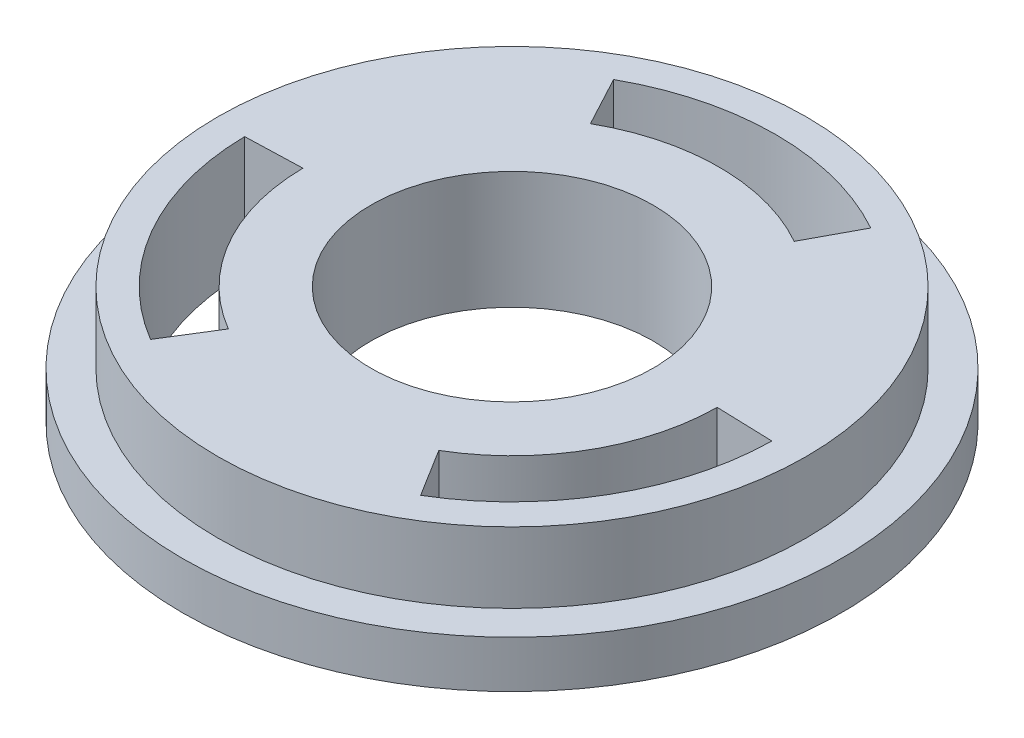
ISO-10303-21;
HEADER;
FILE_DESCRIPTION(('STEP AP214'),'2;1');
FILE_NAME('part.step','',(''),(''),'','','');
FILE_SCHEMA(('AUTOMOTIVE_DESIGN { 1 0 10303 214 1 1 1 1 }'));
ENDSEC;
DATA;
#1=APPLICATION_CONTEXT('core data for automotive mechanical design processes');
#2=APPLICATION_PROTOCOL_DEFINITION('international standard','automotive_design',2000,#1);
#3=PRODUCT_CONTEXT('',#1,'mechanical');
#4=PRODUCT('Part','Part','',(#3));
#5=PRODUCT_RELATED_PRODUCT_CATEGORY('part','',(#4));
#6=PRODUCT_DEFINITION_FORMATION('','',#4);
#7=PRODUCT_DEFINITION_CONTEXT('part definition',#1,'design');
#8=PRODUCT_DEFINITION('design','',#6,#7);
#9=PRODUCT_DEFINITION_SHAPE('','',#8);
#10=(LENGTH_UNIT() NAMED_UNIT(*) SI_UNIT(.MILLI.,.METRE.));
#11=(NAMED_UNIT(*) PLANE_ANGLE_UNIT() SI_UNIT($,.RADIAN.));
#12=(NAMED_UNIT(*) SI_UNIT($,.STERADIAN.) SOLID_ANGLE_UNIT());
#13=UNCERTAINTY_MEASURE_WITH_UNIT(LENGTH_MEASURE(1.E-05),#10,'distance_accuracy_value','');
#14=(GEOMETRIC_REPRESENTATION_CONTEXT(3) GLOBAL_UNCERTAINTY_ASSIGNED_CONTEXT((#13)) GLOBAL_UNIT_ASSIGNED_CONTEXT((#10,
#11,#12)) REPRESENTATION_CONTEXT('',''));
#15=CARTESIAN_POINT('',(0.,0.,0.));
#16=DIRECTION('',(0.,0.,1.));
#17=DIRECTION('',(1.,0.,0.));
#18=AXIS2_PLACEMENT_3D('',#15,#16,#17);
#19=CARTESIAN_POINT('',(0.,2.6,0.));
#20=DIRECTION('',(0.,-1.,0.));
#21=DIRECTION('',(0.,0.,-1.));
#22=AXIS2_PLACEMENT_3D('',#19,#20,#21);
#23=PLANE('',#22);
#24=DIRECTION('',(-0.99948778805349,0.,-0.0320025238370732));
#25=VECTOR('',#24,1.);
#26=CARTESIAN_POINT('',(11.1988787890392,2.6,0.158473557444053));
#27=LINE('',#26,#25);
#28=CARTESIAN_POINT('',(11.1988787890392,2.6,0.158473557444053));
#29=VERTEX_POINT('',#28);
#30=CARTESIAN_POINT('',(8.79962118307565,2.6,0.0816519097522282));
#31=VERTEX_POINT('',#30);
#32=EDGE_CURVE('E144',#29,#31,#27,.T.);
#33=ORIENTED_EDGE('',*,*,#32,.F.);
#34=CARTESIAN_POINT('',(0.,2.6,0.));
#35=DIRECTION('',(0.,1.,0.));
#36=DIRECTION('',(0.,0.,1.));
#37=AXIS2_PLACEMENT_3D('',#34,#35,#36);
#38=CIRCLE('',#37,11.2);
#39=CARTESIAN_POINT('',(5.73668152109433,2.6,9.61927674648852));
#40=VERTEX_POINT('',#39);
#41=EDGE_CURVE('E179',#40,#29,#38,.T.);
#42=ORIENTED_EDGE('',*,*,#41,.F.);
#43=DIRECTION('',(0.527458892654878,0.,0.849580553308096));
#44=VECTOR('',#43,1.);
#45=CARTESIAN_POINT('',(4.47052321965086,2.6,7.57986953334702));
#46=LINE('',#45,#44);
#47=CARTESIAN_POINT('',(4.47052321965086,2.6,7.57986953334702));
#48=VERTEX_POINT('',#47);
#49=EDGE_CURVE('E181',#48,#40,#46,.T.);
#50=ORIENTED_EDGE('',*,*,#49,.F.);
#51=CARTESIAN_POINT('',(0.,2.6,0.));
#52=DIRECTION('',(0.,-1.,0.));
#53=DIRECTION('',(0.,0.,1.));
#54=AXIS2_PLACEMENT_3D('',#51,#52,#53);
#55=CIRCLE('',#54,8.8);
#56=EDGE_CURVE('E185',#31,#48,#55,.T.);
#57=ORIENTED_EDGE('',*,*,#56,.F.);
#58=EDGE_LOOP('',(#33,#42,#50,#57));
#59=FACE_BOUND('',#58,.T.);
#60=DIRECTION('',(0.472028895398614,0.,0.88158307714518));
#61=VECTOR('',#60,1.);
#62=CARTESIAN_POINT('',(-5.46219726794484,2.6,-9.77775030393269));
#63=LINE('',#62,#61);
#64=CARTESIAN_POINT('',(-5.46219726794484,2.6,-9.77775030393269));
#65=VERTEX_POINT('',#64);
#66=CARTESIAN_POINT('',(-4.32909796342481,2.6,-7.66152144309935));
#67=VERTEX_POINT('',#66);
#68=EDGE_CURVE('E155',#65,#67,#63,.T.);
#69=ORIENTED_EDGE('',*,*,#68,.F.);
#70=CARTESIAN_POINT('',(0.,2.6,0.));
#71=DIRECTION('',(0.,1.,0.));
#72=DIRECTION('',(0.,0.,1.));
#73=AXIS2_PLACEMENT_3D('',#70,#71,#72);
#74=CIRCLE('',#73,11.2);
#75=CARTESIAN_POINT('',(5.46219726794491,2.6,-9.77775030393265));
#76=VERTEX_POINT('',#75);
#77=EDGE_CURVE('E136',#76,#65,#74,.T.);
#78=ORIENTED_EDGE('',*,*,#77,.F.);
#79=DIRECTION('',(0.47202889539862,0.,-0.881583077145177));
#80=VECTOR('',#79,1.);
#81=CARTESIAN_POINT('',(4.32909796342486,2.6,-7.66152144309931));
#82=LINE('',#81,#80);
#83=CARTESIAN_POINT('',(4.32909796342486,2.6,-7.66152144309932));
#84=VERTEX_POINT('',#83);
#85=EDGE_CURVE('E147',#84,#76,#82,.T.);
#86=ORIENTED_EDGE('',*,*,#85,.F.);
#87=CARTESIAN_POINT('',(0.,2.6,0.));
#88=DIRECTION('',(0.,-1.,0.));
#89=DIRECTION('',(0.,0.,1.));
#90=AXIS2_PLACEMENT_3D('',#87,#88,#89);
#91=CIRCLE('',#90,8.8);
#92=EDGE_CURVE('E152',#67,#84,#91,.T.);
#93=ORIENTED_EDGE('',*,*,#92,.F.);
#94=EDGE_LOOP('',(#69,#78,#86,#93));
#95=FACE_BOUND('',#94,.T.);
#96=DIRECTION('',(-0.999487788053489,0.,0.03200252383708));
#97=VECTOR('',#96,1.);
#98=CARTESIAN_POINT('',(-8.79962118307565,2.6,0.0816519097522901));
#99=LINE('',#98,#97);
#100=CARTESIAN_POINT('',(-8.79962118307565,2.6,0.0816519097522901));
#101=VERTEX_POINT('',#100);
#102=CARTESIAN_POINT('',(-11.1988787890391,2.6,0.158473557444124));
#103=VERTEX_POINT('',#102);
#104=EDGE_CURVE('E163',#101,#103,#99,.T.);
#105=ORIENTED_EDGE('',*,*,#104,.F.);
#106=CARTESIAN_POINT('',(0.,2.6,0.));
#107=DIRECTION('',(0.,-1.,0.));
#108=DIRECTION('',(0.,0.,1.));
#109=AXIS2_PLACEMENT_3D('',#106,#107,#108);
#110=CIRCLE('',#109,8.8);
#111=CARTESIAN_POINT('',(-4.47052321965081,2.6,7.57986953334706));
#112=VERTEX_POINT('',#111);
#113=EDGE_CURVE('E203',#112,#101,#110,.T.);
#114=ORIENTED_EDGE('',*,*,#113,.F.);
#115=DIRECTION('',(0.527458892654872,0.,-0.849580553308099));
#116=VECTOR('',#115,1.);
#117=CARTESIAN_POINT('',(-5.73668152109427,2.6,9.61927674648856));
#118=LINE('',#117,#116);
#119=CARTESIAN_POINT('',(-5.73668152109427,2.6,9.61927674648856));
#120=VERTEX_POINT('',#119);
#121=EDGE_CURVE('E218',#120,#112,#118,.T.);
#122=ORIENTED_EDGE('',*,*,#121,.F.);
#123=CARTESIAN_POINT('',(0.,2.6,0.));
#124=DIRECTION('',(0.,1.,0.));
#125=DIRECTION('',(0.,0.,1.));
#126=AXIS2_PLACEMENT_3D('',#123,#124,#125);
#127=CIRCLE('',#126,11.2);
#128=EDGE_CURVE('E215',#103,#120,#127,.T.);
#129=ORIENTED_EDGE('',*,*,#128,.F.);
#130=EDGE_LOOP('',(#105,#114,#122,#129));
#131=FACE_BOUND('',#130,.T.);
#132=CARTESIAN_POINT('',(0.,2.6,0.));
#133=DIRECTION('',(0.,-1.,0.));
#134=DIRECTION('',(0.,0.,-1.));
#135=AXIS2_PLACEMENT_3D('',#132,#133,#134);
#136=CIRCLE('',#135,12.5);
#137=CARTESIAN_POINT('',(0.,2.6,-12.5));
#138=VERTEX_POINT('',#137);
#139=EDGE_CURVE('E11',#138,#138,#136,.F.);
#140=ORIENTED_EDGE('',*,*,#139,.T.);
#141=EDGE_LOOP('',(#140));
#142=FACE_BOUND('',#141,.T.);
#143=CARTESIAN_POINT('',(0.,2.6,0.));
#144=DIRECTION('',(0.,-1.,0.));
#145=DIRECTION('',(0.,0.,-1.));
#146=AXIS2_PLACEMENT_3D('',#143,#144,#145);
#147=CIRCLE('',#146,6.);
#148=CARTESIAN_POINT('',(0.,2.6,-6.));
#149=VERTEX_POINT('',#148);
#150=EDGE_CURVE('E50',#149,#149,#147,.F.);
#151=ORIENTED_EDGE('',*,*,#150,.F.);
#152=EDGE_LOOP('',(#151));
#153=FACE_BOUND('',#152,.T.);
#154=ADVANCED_FACE('F43',(#59,#95,#131,#142,#153),#23,.F.);
#155=CARTESIAN_POINT('',(0.,0.,0.));
#156=DIRECTION('',(0.,-1.,0.));
#157=DIRECTION('',(0.,0.,-1.));
#158=AXIS2_PLACEMENT_3D('',#155,#156,#157);
#159=CYLINDRICAL_SURFACE('',#158,14.);
#160=CARTESIAN_POINT('',(0.,-2.4,0.));
#161=DIRECTION('',(0.,-1.,0.));
#162=DIRECTION('',(0.,0.,-1.));
#163=AXIS2_PLACEMENT_3D('',#160,#161,#162);
#164=CIRCLE('',#163,14.);
#165=CARTESIAN_POINT('',(0.,-2.4,-14.));
#166=VERTEX_POINT('',#165);
#167=EDGE_CURVE('E236',#166,#166,#164,.T.);
#168=ORIENTED_EDGE('',*,*,#167,.F.);
#169=EDGE_LOOP('',(#168));
#170=FACE_BOUND('',#169,.T.);
#171=CARTESIAN_POINT('',(0.,-0.400000000000002,0.));
#172=DIRECTION('',(0.,-1.,0.));
#173=DIRECTION('',(0.,0.,-1.));
#174=AXIS2_PLACEMENT_3D('',#171,#172,#173);
#175=CIRCLE('',#174,14.);
#176=CARTESIAN_POINT('',(0.,-0.400000000000002,-14.));
#177=VERTEX_POINT('',#176);
#178=EDGE_CURVE('E233',#177,#177,#175,.T.);
#179=ORIENTED_EDGE('',*,*,#178,.T.);
#180=EDGE_LOOP('',(#179));
#181=FACE_BOUND('',#180,.T.);
#182=ADVANCED_FACE('F248',(#170,#181),#159,.T.);
#183=CARTESIAN_POINT('',(-6.,-2.4,0.));
#184=DIRECTION('',(0.,1.,0.));
#185=DIRECTION('',(0.,0.,1.));
#186=AXIS2_PLACEMENT_3D('',#183,#184,#185);
#187=PLANE('',#186);
#188=DIRECTION('',(0.527458892654878,0.,0.849580553308096));
#189=VECTOR('',#188,1.);
#190=CARTESIAN_POINT('',(4.47052321965086,-2.4,7.57986953334702));
#191=LINE('',#190,#189);
#192=CARTESIAN_POINT('',(4.47052321965086,-2.4,7.57986953334702));
#193=VERTEX_POINT('',#192);
#194=CARTESIAN_POINT('',(5.73668152109433,-2.4,9.61927674648852));
#195=VERTEX_POINT('',#194);
#196=EDGE_CURVE('E172',#193,#195,#191,.T.);
#197=ORIENTED_EDGE('',*,*,#196,.T.);
#198=CARTESIAN_POINT('',(0.,-2.4,0.));
#199=DIRECTION('',(0.,1.,0.));
#200=DIRECTION('',(0.,0.,1.));
#201=AXIS2_PLACEMENT_3D('',#198,#199,#200);
#202=CIRCLE('',#201,11.2);
#203=CARTESIAN_POINT('',(11.1988787890392,-2.4,0.158473557444053));
#204=VERTEX_POINT('',#203);
#205=EDGE_CURVE('E182',#195,#204,#202,.T.);
#206=ORIENTED_EDGE('',*,*,#205,.T.);
#207=DIRECTION('',(-0.99948778805349,0.,-0.0320025238370732));
#208=VECTOR('',#207,1.);
#209=CARTESIAN_POINT('',(11.1988787890392,-2.4,0.158473557444053));
#210=LINE('',#209,#208);
#211=CARTESIAN_POINT('',(8.79962118307565,-2.4,0.0816519097522283));
#212=VERTEX_POINT('',#211);
#213=EDGE_CURVE('E194',#204,#212,#210,.T.);
#214=ORIENTED_EDGE('',*,*,#213,.T.);
#215=CARTESIAN_POINT('',(0.,-2.4,0.));
#216=DIRECTION('',(0.,-1.,0.));
#217=DIRECTION('',(0.,0.,1.));
#218=AXIS2_PLACEMENT_3D('',#215,#216,#217);
#219=CIRCLE('',#218,8.8);
#220=EDGE_CURVE('E191',#212,#193,#219,.T.);
#221=ORIENTED_EDGE('',*,*,#220,.T.);
#222=EDGE_LOOP('',(#197,#206,#214,#221));
#223=FACE_BOUND('',#222,.T.);
#224=DIRECTION('',(0.47202889539862,0.,-0.881583077145177));
#225=VECTOR('',#224,1.);
#226=CARTESIAN_POINT('',(4.32909796342486,-2.4,-7.66152144309931));
#227=LINE('',#226,#225);
#228=CARTESIAN_POINT('',(4.32909796342486,-2.4,-7.66152144309932));
#229=VERTEX_POINT('',#228);
#230=CARTESIAN_POINT('',(5.46219726794491,-2.4,-9.77775030393265));
#231=VERTEX_POINT('',#230);
#232=EDGE_CURVE('E164',#229,#231,#227,.T.);
#233=ORIENTED_EDGE('',*,*,#232,.T.);
#234=CARTESIAN_POINT('',(0.,-2.4,0.));
#235=DIRECTION('',(0.,1.,0.));
#236=DIRECTION('',(0.,0.,1.));
#237=AXIS2_PLACEMENT_3D('',#234,#235,#236);
#238=CIRCLE('',#237,11.2);
#239=CARTESIAN_POINT('',(-5.46219726794484,-2.4,-9.77775030393269));
#240=VERTEX_POINT('',#239);
#241=EDGE_CURVE('E139',#231,#240,#238,.T.);
#242=ORIENTED_EDGE('',*,*,#241,.T.);
#243=DIRECTION('',(0.472028895398614,0.,0.88158307714518));
#244=VECTOR('',#243,1.);
#245=CARTESIAN_POINT('',(-5.46219726794484,-2.4,-9.77775030393269));
#246=LINE('',#245,#244);
#247=CARTESIAN_POINT('',(-4.32909796342481,-2.4,-7.66152144309935));
#248=VERTEX_POINT('',#247);
#249=EDGE_CURVE('E157',#240,#248,#246,.T.);
#250=ORIENTED_EDGE('',*,*,#249,.T.);
#251=CARTESIAN_POINT('',(0.,-2.4,0.));
#252=DIRECTION('',(0.,-1.,0.));
#253=DIRECTION('',(0.,0.,1.));
#254=AXIS2_PLACEMENT_3D('',#251,#252,#253);
#255=CIRCLE('',#254,8.8);
#256=EDGE_CURVE('E166',#248,#229,#255,.T.);
#257=ORIENTED_EDGE('',*,*,#256,.T.);
#258=EDGE_LOOP('',(#233,#242,#250,#257));
#259=FACE_BOUND('',#258,.T.);
#260=DIRECTION('',(0.527458892654872,0.,-0.849580553308099));
#261=VECTOR('',#260,1.);
#262=CARTESIAN_POINT('',(-5.73668152109427,-2.4,9.61927674648856));
#263=LINE('',#262,#261);
#264=CARTESIAN_POINT('',(-5.73668152109427,-2.4,9.61927674648856));
#265=VERTEX_POINT('',#264);
#266=CARTESIAN_POINT('',(-4.47052321965081,-2.4,7.57986953334706));
#267=VERTEX_POINT('',#266);
#268=EDGE_CURVE('E209',#265,#267,#263,.T.);
#269=ORIENTED_EDGE('',*,*,#268,.T.);
#270=CARTESIAN_POINT('',(0.,-2.4,0.));
#271=DIRECTION('',(0.,-1.,0.));
#272=DIRECTION('',(0.,0.,1.));
#273=AXIS2_PLACEMENT_3D('',#270,#271,#272);
#274=CIRCLE('',#273,8.8);
#275=CARTESIAN_POINT('',(-8.79962118307565,-2.4,0.0816519097522901));
#276=VERTEX_POINT('',#275);
#277=EDGE_CURVE('E199',#267,#276,#274,.T.);
#278=ORIENTED_EDGE('',*,*,#277,.T.);
#279=DIRECTION('',(-0.999487788053489,0.,0.03200252383708));
#280=VECTOR('',#279,1.);
#281=CARTESIAN_POINT('',(-8.79962118307565,-2.4,0.0816519097522901));
#282=LINE('',#281,#280);
#283=CARTESIAN_POINT('',(-11.1988787890391,-2.4,0.158473557444131));
#284=VERTEX_POINT('',#283);
#285=EDGE_CURVE('E202',#276,#284,#282,.T.);
#286=ORIENTED_EDGE('',*,*,#285,.T.);
#287=CARTESIAN_POINT('',(0.,-2.4,0.));
#288=DIRECTION('',(0.,1.,0.));
#289=DIRECTION('',(0.,0.,1.));
#290=AXIS2_PLACEMENT_3D('',#287,#288,#289);
#291=CIRCLE('',#290,11.2);
#292=EDGE_CURVE('E206',#284,#265,#291,.T.);
#293=ORIENTED_EDGE('',*,*,#292,.T.);
#294=EDGE_LOOP('',(#269,#278,#286,#293));
#295=FACE_BOUND('',#294,.T.);
#296=CARTESIAN_POINT('',(0.,-2.4,0.));
#297=DIRECTION('',(0.,-1.,0.));
#298=DIRECTION('',(0.,0.,-1.));
#299=AXIS2_PLACEMENT_3D('',#296,#297,#298);
#300=CIRCLE('',#299,6.);
#301=CARTESIAN_POINT('',(0.,-2.4,-6.));
#302=VERTEX_POINT('',#301);
#303=EDGE_CURVE('E239',#302,#302,#300,.T.);
#304=ORIENTED_EDGE('',*,*,#303,.F.);
#305=EDGE_LOOP('',(#304));
#306=FACE_BOUND('',#305,.T.);
#307=ORIENTED_EDGE('',*,*,#167,.T.);
#308=EDGE_LOOP('',(#307));
#309=FACE_BOUND('',#308,.T.);
#310=ADVANCED_FACE('F255',(#223,#259,#295,#306,#309),#187,.F.);
#311=CARTESIAN_POINT('',(0.,9.50999999999998,0.));
#312=DIRECTION('',(0.,-1.,0.));
#313=DIRECTION('',(1.,0.,0.));
#314=AXIS2_PLACEMENT_3D('',#311,#312,#313);
#315=CYLINDRICAL_SURFACE('',#314,6.);
#316=ORIENTED_EDGE('',*,*,#150,.T.);
#317=EDGE_LOOP('',(#316));
#318=FACE_BOUND('',#317,.T.);
#319=ORIENTED_EDGE('',*,*,#303,.T.);
#320=EDGE_LOOP('',(#319));
#321=FACE_BOUND('',#320,.T.);
#322=ADVANCED_FACE('F244',(#318,#321),#315,.F.);
#323=CARTESIAN_POINT('',(-12.5,-0.400000000000002,0.));
#324=DIRECTION('',(0.,-1.,0.));
#325=DIRECTION('',(0.,0.,-1.));
#326=AXIS2_PLACEMENT_3D('',#323,#324,#325);
#327=PLANE('',#326);
#328=ORIENTED_EDGE('',*,*,#178,.F.);
#329=EDGE_LOOP('',(#328));
#330=FACE_BOUND('',#329,.T.);
#331=CARTESIAN_POINT('',(0.,-0.400000000000002,0.));
#332=DIRECTION('',(0.,-1.,0.));
#333=DIRECTION('',(0.,0.,-1.));
#334=AXIS2_PLACEMENT_3D('',#331,#332,#333);
#335=CIRCLE('',#334,12.5);
#336=CARTESIAN_POINT('',(0.,-0.400000000000002,-12.5));
#337=VERTEX_POINT('',#336);
#338=EDGE_CURVE('E225',#337,#337,#335,.T.);
#339=ORIENTED_EDGE('',*,*,#338,.T.);
#340=EDGE_LOOP('',(#339));
#341=FACE_BOUND('',#340,.T.);
#342=ADVANCED_FACE('F261',(#330,#341),#327,.F.);
#343=CARTESIAN_POINT('',(0.,9.51,0.));
#344=DIRECTION('',(0.,1.,0.));
#345=DIRECTION('',(-1.,0.,0.));
#346=AXIS2_PLACEMENT_3D('',#343,#344,#345);
#347=CYLINDRICAL_SURFACE('',#346,12.5);
#348=ORIENTED_EDGE('',*,*,#139,.F.);
#349=EDGE_LOOP('',(#348));
#350=FACE_BOUND('',#349,.T.);
#351=ORIENTED_EDGE('',*,*,#338,.F.);
#352=EDGE_LOOP('',(#351));
#353=FACE_BOUND('',#352,.T.);
#354=ADVANCED_FACE('F250',(#350,#353),#347,.T.);
#355=CARTESIAN_POINT('',(0.,-2.4,0.));
#356=DIRECTION('',(0.,1.,0.));
#357=DIRECTION('',(0.,0.,1.));
#358=AXIS2_PLACEMENT_3D('',#355,#356,#357);
#359=CYLINDRICAL_SURFACE('',#358,8.8);
#360=ORIENTED_EDGE('',*,*,#113,.T.);
#361=DIRECTION('',(0.,1.,0.));
#362=VECTOR('',#361,1.);
#363=CARTESIAN_POINT('',(-8.79962118307565,-2.4,0.0816519097522901));
#364=LINE('',#363,#362);
#365=EDGE_CURVE('E212',#276,#101,#364,.T.);
#366=ORIENTED_EDGE('',*,*,#365,.F.);
#367=ORIENTED_EDGE('',*,*,#277,.F.);
#368=DIRECTION('',(0.,1.,0.));
#369=VECTOR('',#368,1.);
#370=CARTESIAN_POINT('',(-4.47052321965081,-2.4,7.57986953334706));
#371=LINE('',#370,#369);
#372=EDGE_CURVE('E223',#267,#112,#371,.T.);
#373=ORIENTED_EDGE('',*,*,#372,.T.);
#374=EDGE_LOOP('',(#360,#366,#367,#373));
#375=FACE_BOUND('',#374,.T.);
#376=ADVANCED_FACE('F258',(#375),#359,.T.);
#377=CARTESIAN_POINT('',(-5.73668152109427,-2.4,9.61927674648856));
#378=DIRECTION('',(0.849580553308099,0.,0.527458892654872));
#379=DIRECTION('',(0.527458892654872,0.,-0.849580553308099));
#380=AXIS2_PLACEMENT_3D('',#377,#378,#379);
#381=PLANE('',#380);
#382=ORIENTED_EDGE('',*,*,#121,.T.);
#383=ORIENTED_EDGE('',*,*,#372,.F.);
#384=ORIENTED_EDGE('',*,*,#268,.F.);
#385=DIRECTION('',(0.,1.,0.));
#386=VECTOR('',#385,1.);
#387=CARTESIAN_POINT('',(-5.73668152109427,-2.4,9.61927674648856));
#388=LINE('',#387,#386);
#389=EDGE_CURVE('E226',#265,#120,#388,.T.);
#390=ORIENTED_EDGE('',*,*,#389,.T.);
#391=EDGE_LOOP('',(#382,#383,#384,#390));
#392=FACE_BOUND('',#391,.T.);
#393=ADVANCED_FACE('F266',(#392),#381,.F.);
#394=CARTESIAN_POINT('',(0.,-2.4,0.));
#395=DIRECTION('',(0.,1.,0.));
#396=DIRECTION('',(0.,0.,1.));
#397=AXIS2_PLACEMENT_3D('',#394,#395,#396);
#398=CYLINDRICAL_SURFACE('',#397,11.2);
#399=ORIENTED_EDGE('',*,*,#128,.T.);
#400=ORIENTED_EDGE('',*,*,#389,.F.);
#401=ORIENTED_EDGE('',*,*,#292,.F.);
#402=DIRECTION('',(0.,1.,0.));
#403=VECTOR('',#402,1.);
#404=CARTESIAN_POINT('',(-11.1988787890391,-2.4,0.158473557444124));
#405=LINE('',#404,#403);
#406=EDGE_CURVE('E228',#284,#103,#405,.T.);
#407=ORIENTED_EDGE('',*,*,#406,.T.);
#408=EDGE_LOOP('',(#399,#400,#401,#407));
#409=FACE_BOUND('',#408,.T.);
#410=ADVANCED_FACE('F283',(#409),#398,.F.);
#411=CARTESIAN_POINT('',(-8.79962118307565,-2.4,0.0816519097522901));
#412=DIRECTION('',(-0.03200252383708,0.,-0.99948778805349));
#413=DIRECTION('',(-0.99948778805349,0.,0.03200252383708));
#414=AXIS2_PLACEMENT_3D('',#411,#412,#413);
#415=PLANE('',#414);
#416=ORIENTED_EDGE('',*,*,#104,.T.);
#417=ORIENTED_EDGE('',*,*,#406,.F.);
#418=ORIENTED_EDGE('',*,*,#285,.F.);
#419=ORIENTED_EDGE('',*,*,#365,.T.);
#420=EDGE_LOOP('',(#416,#417,#418,#419));
#421=FACE_BOUND('',#420,.T.);
#422=ADVANCED_FACE('F280',(#421),#415,.F.);
#423=CARTESIAN_POINT('',(0.,-2.4,0.));
#424=DIRECTION('',(0.,1.,0.));
#425=DIRECTION('',(0.,0.,1.));
#426=AXIS2_PLACEMENT_3D('',#423,#424,#425);
#427=CYLINDRICAL_SURFACE('',#426,11.2);
#428=ORIENTED_EDGE('',*,*,#77,.T.);
#429=DIRECTION('',(0.,1.,0.));
#430=VECTOR('',#429,1.);
#431=CARTESIAN_POINT('',(-5.46219726794484,-2.4,-9.77775030393269));
#432=LINE('',#431,#430);
#433=EDGE_CURVE('E65',#240,#65,#432,.T.);
#434=ORIENTED_EDGE('',*,*,#433,.F.);
#435=ORIENTED_EDGE('',*,*,#241,.F.);
#436=DIRECTION('',(0.,1.,0.));
#437=VECTOR('',#436,1.);
#438=CARTESIAN_POINT('',(5.46219726794491,-2.4,-9.77775030393265));
#439=LINE('',#438,#437);
#440=EDGE_CURVE('E132',#231,#76,#439,.T.);
#441=ORIENTED_EDGE('',*,*,#440,.T.);
#442=EDGE_LOOP('',(#428,#434,#435,#441));
#443=FACE_BOUND('',#442,.T.);
#444=ADVANCED_FACE('F134',(#443),#427,.F.);
#445=CARTESIAN_POINT('',(4.32909796342486,-2.4,-7.66152144309931));
#446=DIRECTION('',(0.881583077145177,0.,0.47202889539862));
#447=DIRECTION('',(0.47202889539862,0.,-0.881583077145177));
#448=AXIS2_PLACEMENT_3D('',#445,#446,#447);
#449=PLANE('',#448);
#450=ORIENTED_EDGE('',*,*,#85,.T.);
#451=ORIENTED_EDGE('',*,*,#440,.F.);
#452=ORIENTED_EDGE('',*,*,#232,.F.);
#453=DIRECTION('',(0.,1.,0.));
#454=VECTOR('',#453,1.);
#455=CARTESIAN_POINT('',(4.32909796342486,-2.4,-7.66152144309932));
#456=LINE('',#455,#454);
#457=EDGE_CURVE('E143',#229,#84,#456,.T.);
#458=ORIENTED_EDGE('',*,*,#457,.T.);
#459=EDGE_LOOP('',(#450,#451,#452,#458));
#460=FACE_BOUND('',#459,.T.);
#461=ADVANCED_FACE('F148',(#460),#449,.F.);
#462=CARTESIAN_POINT('',(0.,-2.4,0.));
#463=DIRECTION('',(0.,1.,0.));
#464=DIRECTION('',(0.,0.,1.));
#465=AXIS2_PLACEMENT_3D('',#462,#463,#464);
#466=CYLINDRICAL_SURFACE('',#465,8.8);
#467=ORIENTED_EDGE('',*,*,#92,.T.);
#468=ORIENTED_EDGE('',*,*,#457,.F.);
#469=ORIENTED_EDGE('',*,*,#256,.F.);
#470=DIRECTION('',(0.,1.,0.));
#471=VECTOR('',#470,1.);
#472=CARTESIAN_POINT('',(-4.32909796342481,-2.4,-7.66152144309935));
#473=LINE('',#472,#471);
#474=EDGE_CURVE('E319',#248,#67,#473,.T.);
#475=ORIENTED_EDGE('',*,*,#474,.T.);
#476=EDGE_LOOP('',(#467,#468,#469,#475));
#477=FACE_BOUND('',#476,.T.);
#478=ADVANCED_FACE('F311',(#477),#466,.T.);
#479=CARTESIAN_POINT('',(-5.46219726794484,-2.4,-9.77775030393269));
#480=DIRECTION('',(-0.88158307714518,0.,0.472028895398614));
#481=DIRECTION('',(0.472028895398614,0.,0.88158307714518));
#482=AXIS2_PLACEMENT_3D('',#479,#480,#481);
#483=PLANE('',#482);
#484=ORIENTED_EDGE('',*,*,#68,.T.);
#485=ORIENTED_EDGE('',*,*,#474,.F.);
#486=ORIENTED_EDGE('',*,*,#249,.F.);
#487=ORIENTED_EDGE('',*,*,#433,.T.);
#488=EDGE_LOOP('',(#484,#485,#486,#487));
#489=FACE_BOUND('',#488,.T.);
#490=ADVANCED_FACE('F295',(#489),#483,.F.);
#491=CARTESIAN_POINT('',(0.,-2.4,0.));
#492=DIRECTION('',(0.,1.,0.));
#493=DIRECTION('',(0.,0.,1.));
#494=AXIS2_PLACEMENT_3D('',#491,#492,#493);
#495=CYLINDRICAL_SURFACE('',#494,11.2);
#496=ORIENTED_EDGE('',*,*,#41,.T.);
#497=DIRECTION('',(0.,1.,0.));
#498=VECTOR('',#497,1.);
#499=CARTESIAN_POINT('',(11.1988787890392,-2.4,0.158473557444053));
#500=LINE('',#499,#498);
#501=EDGE_CURVE('E57',#204,#29,#500,.T.);
#502=ORIENTED_EDGE('',*,*,#501,.F.);
#503=ORIENTED_EDGE('',*,*,#205,.F.);
#504=DIRECTION('',(0.,1.,0.));
#505=VECTOR('',#504,1.);
#506=CARTESIAN_POINT('',(5.73668152109433,-2.4,9.61927674648852));
#507=LINE('',#506,#505);
#508=EDGE_CURVE('E177',#195,#40,#507,.T.);
#509=ORIENTED_EDGE('',*,*,#508,.T.);
#510=EDGE_LOOP('',(#496,#502,#503,#509));
#511=FACE_BOUND('',#510,.T.);
#512=ADVANCED_FACE('F291',(#511),#495,.F.);
#513=CARTESIAN_POINT('',(4.47052321965086,-2.4,7.57986953334702));
#514=DIRECTION('',(-0.849580553308096,0.,0.527458892654878));
#515=DIRECTION('',(0.527458892654878,0.,0.849580553308096));
#516=AXIS2_PLACEMENT_3D('',#513,#514,#515);
#517=PLANE('',#516);
#518=ORIENTED_EDGE('',*,*,#49,.T.);
#519=ORIENTED_EDGE('',*,*,#508,.F.);
#520=ORIENTED_EDGE('',*,*,#196,.F.);
#521=DIRECTION('',(0.,1.,0.));
#522=VECTOR('',#521,1.);
#523=CARTESIAN_POINT('',(4.47052321965086,-2.4,7.57986953334702));
#524=LINE('',#523,#522);
#525=EDGE_CURVE('E175',#193,#48,#524,.T.);
#526=ORIENTED_EDGE('',*,*,#525,.T.);
#527=EDGE_LOOP('',(#518,#519,#520,#526));
#528=FACE_BOUND('',#527,.T.);
#529=ADVANCED_FACE('F294',(#528),#517,.F.);
#530=CARTESIAN_POINT('',(0.,-2.4,0.));
#531=DIRECTION('',(0.,1.,0.));
#532=DIRECTION('',(0.,0.,1.));
#533=AXIS2_PLACEMENT_3D('',#530,#531,#532);
#534=CYLINDRICAL_SURFACE('',#533,8.8);
#535=ORIENTED_EDGE('',*,*,#56,.T.);
#536=ORIENTED_EDGE('',*,*,#525,.F.);
#537=ORIENTED_EDGE('',*,*,#220,.F.);
#538=DIRECTION('',(0.,1.,0.));
#539=VECTOR('',#538,1.);
#540=CARTESIAN_POINT('',(8.79962118307565,-2.4,0.0816519097522282));
#541=LINE('',#540,#539);
#542=EDGE_CURVE('E173',#212,#31,#541,.T.);
#543=ORIENTED_EDGE('',*,*,#542,.T.);
#544=EDGE_LOOP('',(#535,#536,#537,#543));
#545=FACE_BOUND('',#544,.T.);
#546=ADVANCED_FACE('F299',(#545),#534,.T.);
#547=CARTESIAN_POINT('',(11.1988787890392,-2.4,0.158473557444053));
#548=DIRECTION('',(0.0320025238370732,0.,-0.99948778805349));
#549=DIRECTION('',(-0.99948778805349,0.,-0.0320025238370732));
#550=AXIS2_PLACEMENT_3D('',#547,#548,#549);
#551=PLANE('',#550);
#552=ORIENTED_EDGE('',*,*,#32,.T.);
#553=ORIENTED_EDGE('',*,*,#542,.F.);
#554=ORIENTED_EDGE('',*,*,#213,.F.);
#555=ORIENTED_EDGE('',*,*,#501,.T.);
#556=EDGE_LOOP('',(#552,#553,#554,#555));
#557=FACE_BOUND('',#556,.T.);
#558=ADVANCED_FACE('F303',(#557),#551,.F.);
#559=CLOSED_SHELL('',(#154,#182,#310,#322,#342,#354,#376,#393,#410,#422,#444,#461,#478,#490,
#512,#529,#546,#558));
#560=MANIFOLD_SOLID_BREP('B2',#559);
#561=ADVANCED_BREP_SHAPE_REPRESENTATION('',(#18,#560),#14);
#562=SHAPE_DEFINITION_REPRESENTATION(#9,#561);
ENDSEC;
END-ISO-10303-21;
